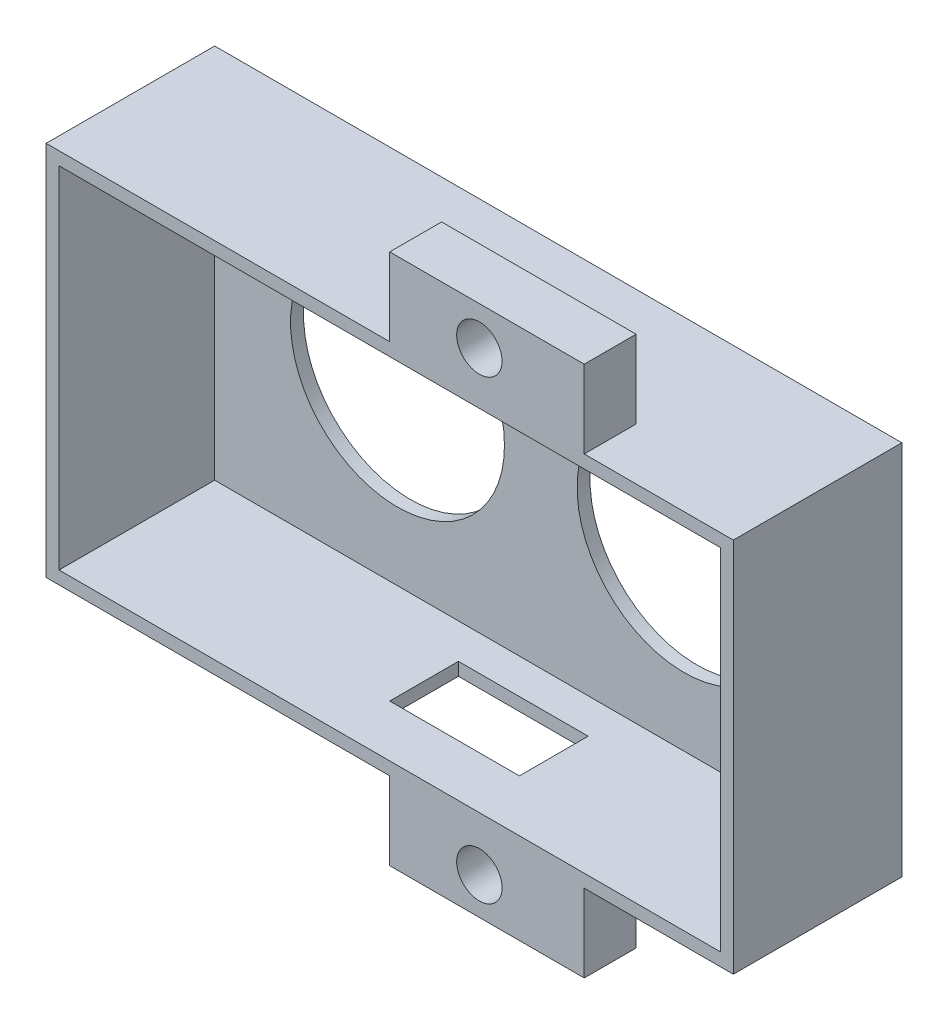
ISO-10303-21;
HEADER;
FILE_DESCRIPTION(('STEP AP214'),'2;1');
FILE_NAME('part.step','',(''),(''),'','','');
FILE_SCHEMA(('AUTOMOTIVE_DESIGN { 1 0 10303 214 1 1 1 1 }'));
ENDSEC;
DATA;
#1=APPLICATION_CONTEXT('core data for automotive mechanical design processes');
#2=APPLICATION_PROTOCOL_DEFINITION('international standard','automotive_design',2000,#1);
#3=PRODUCT_CONTEXT('',#1,'mechanical');
#4=PRODUCT('Part','Part','',(#3));
#5=PRODUCT_RELATED_PRODUCT_CATEGORY('part','',(#4));
#6=PRODUCT_DEFINITION_FORMATION('','',#4);
#7=PRODUCT_DEFINITION_CONTEXT('part definition',#1,'design');
#8=PRODUCT_DEFINITION('design','',#6,#7);
#9=PRODUCT_DEFINITION_SHAPE('','',#8);
#10=(LENGTH_UNIT() NAMED_UNIT(*) SI_UNIT(.MILLI.,.METRE.));
#11=(NAMED_UNIT(*) PLANE_ANGLE_UNIT() SI_UNIT($,.RADIAN.));
#12=(NAMED_UNIT(*) SI_UNIT($,.STERADIAN.) SOLID_ANGLE_UNIT());
#13=UNCERTAINTY_MEASURE_WITH_UNIT(LENGTH_MEASURE(1.E-05),#10,'distance_accuracy_value','');
#14=(GEOMETRIC_REPRESENTATION_CONTEXT(3) GLOBAL_UNCERTAINTY_ASSIGNED_CONTEXT((#13)) GLOBAL_UNIT_ASSIGNED_CONTEXT((#10,
#11,#12)) REPRESENTATION_CONTEXT('',''));
#15=CARTESIAN_POINT('',(0.,0.,0.));
#16=DIRECTION('',(0.,0.,1.));
#17=DIRECTION('',(1.,0.,0.));
#18=AXIS2_PLACEMENT_3D('',#15,#16,#17);
#19=CARTESIAN_POINT('',(-26.5,-14.5,13.));
#20=DIRECTION('',(0.,1.,0.));
#21=DIRECTION('',(0.,0.,1.));
#22=AXIS2_PLACEMENT_3D('',#19,#20,#21);
#23=PLANE('',#22);
#24=DIRECTION('',(0.,0.,1.));
#25=VECTOR('',#24,1.);
#26=CARTESIAN_POINT('',(15.,-14.5,9.));
#27=LINE('',#26,#25);
#28=CARTESIAN_POINT('',(15.,-14.5,9.));
#29=VERTEX_POINT('',#28);
#30=CARTESIAN_POINT('',(15.,-14.5,13.));
#31=VERTEX_POINT('',#30);
#32=EDGE_CURVE('E224',#29,#31,#27,.T.);
#33=ORIENTED_EDGE('',*,*,#32,.F.);
#34=DIRECTION('',(-1.,0.,0.));
#35=VECTOR('',#34,1.);
#36=CARTESIAN_POINT('',(0.,-14.5,9.));
#37=LINE('',#36,#35);
#38=CARTESIAN_POINT('',(6.,-14.5,9.));
#39=VERTEX_POINT('',#38);
#40=EDGE_CURVE('E189',#29,#39,#37,.T.);
#41=ORIENTED_EDGE('',*,*,#40,.T.);
#42=DIRECTION('',(0.,0.,1.));
#43=VECTOR('',#42,1.);
#44=CARTESIAN_POINT('',(6.,-14.5,9.));
#45=LINE('',#44,#43);
#46=CARTESIAN_POINT('',(6.,-14.5,3.7));
#47=VERTEX_POINT('',#46);
#48=EDGE_CURVE('E258',#47,#39,#45,.T.);
#49=ORIENTED_EDGE('',*,*,#48,.F.);
#50=DIRECTION('',(1.,0.,0.));
#51=VECTOR('',#50,1.);
#52=CARTESIAN_POINT('',(-4.,-14.5,3.7));
#53=LINE('',#52,#51);
#54=CARTESIAN_POINT('',(-4.,-14.5,3.7));
#55=VERTEX_POINT('',#54);
#56=EDGE_CURVE('E277',#55,#47,#53,.T.);
#57=ORIENTED_EDGE('',*,*,#56,.F.);
#58=DIRECTION('',(0.,0.,-1.));
#59=VECTOR('',#58,1.);
#60=CARTESIAN_POINT('',(-4.,-14.5,9.));
#61=LINE('',#60,#59);
#62=CARTESIAN_POINT('',(-4.,-14.5,9.));
#63=VERTEX_POINT('',#62);
#64=EDGE_CURVE('E273',#63,#55,#61,.T.);
#65=ORIENTED_EDGE('',*,*,#64,.F.);
#66=DIRECTION('',(-1.,0.,0.));
#67=VECTOR('',#66,1.);
#68=CARTESIAN_POINT('',(-4.,-14.5,9.));
#69=LINE('',#68,#67);
#70=CARTESIAN_POINT('',(0.,-14.5,9.));
#71=VERTEX_POINT('',#70);
#72=EDGE_CURVE('E270',#71,#63,#69,.T.);
#73=ORIENTED_EDGE('',*,*,#72,.F.);
#74=DIRECTION('',(0.,0.,1.));
#75=VECTOR('',#74,1.);
#76=CARTESIAN_POINT('',(0.,-14.5,9.));
#77=LINE('',#76,#75);
#78=CARTESIAN_POINT('',(0.,-14.5,13.));
#79=VERTEX_POINT('',#78);
#80=EDGE_CURVE('E202',#71,#79,#77,.T.);
#81=ORIENTED_EDGE('',*,*,#80,.T.);
#82=DIRECTION('',(1.,0.,0.));
#83=VECTOR('',#82,1.);
#84=CARTESIAN_POINT('',(-26.5,-14.5,13.));
#85=LINE('',#84,#83);
#86=CARTESIAN_POINT('',(-26.5,-14.5,13.));
#87=VERTEX_POINT('',#86);
#88=EDGE_CURVE('E365',#87,#79,#85,.T.);
#89=ORIENTED_EDGE('',*,*,#88,.F.);
#90=DIRECTION('',(0.,0.,-1.));
#91=VECTOR('',#90,1.);
#92=CARTESIAN_POINT('',(-26.5,-14.5,13.));
#93=LINE('',#92,#91);
#94=CARTESIAN_POINT('',(-26.5,-14.5,0.));
#95=VERTEX_POINT('',#94);
#96=EDGE_CURVE('E384',#87,#95,#93,.T.);
#97=ORIENTED_EDGE('',*,*,#96,.T.);
#98=DIRECTION('',(1.,0.,0.));
#99=VECTOR('',#98,1.);
#100=CARTESIAN_POINT('',(-26.5,-14.5,0.));
#101=LINE('',#100,#99);
#102=CARTESIAN_POINT('',(26.5,-14.5,0.));
#103=VERTEX_POINT('',#102);
#104=EDGE_CURVE('E356',#95,#103,#101,.T.);
#105=ORIENTED_EDGE('',*,*,#104,.T.);
#106=DIRECTION('',(0.,0.,-1.));
#107=VECTOR('',#106,1.);
#108=CARTESIAN_POINT('',(26.5,-14.5,13.));
#109=LINE('',#108,#107);
#110=CARTESIAN_POINT('',(26.5,-14.5,13.));
#111=VERTEX_POINT('',#110);
#112=EDGE_CURVE('E369',#111,#103,#109,.T.);
#113=ORIENTED_EDGE('',*,*,#112,.F.);
#114=EDGE_CURVE('E364',#31,#111,#85,.T.);
#115=ORIENTED_EDGE('',*,*,#114,.F.);
#116=EDGE_LOOP('',(#33,#41,#49,#57,#65,#73,#81,#89,#97,#105,#113,#115));
#117=FACE_BOUND('',#116,.T.);
#118=ADVANCED_FACE('F41',(#117),#23,.F.);
#119=CARTESIAN_POINT('',(-26.5,14.5,13.));
#120=DIRECTION('',(0.,-1.,0.));
#121=DIRECTION('',(0.,0.,-1.));
#122=AXIS2_PLACEMENT_3D('',#119,#120,#121);
#123=PLANE('',#122);
#124=DIRECTION('',(0.,0.,1.));
#125=VECTOR('',#124,1.);
#126=CARTESIAN_POINT('',(0.,14.5,9.));
#127=LINE('',#126,#125);
#128=CARTESIAN_POINT('',(0.,14.5,9.));
#129=VERTEX_POINT('',#128);
#130=CARTESIAN_POINT('',(0.,14.5,13.));
#131=VERTEX_POINT('',#130);
#132=EDGE_CURVE('E246',#129,#131,#127,.T.);
#133=ORIENTED_EDGE('',*,*,#132,.F.);
#134=DIRECTION('',(1.,0.,0.));
#135=VECTOR('',#134,1.);
#136=CARTESIAN_POINT('',(0.,14.5,9.));
#137=LINE('',#136,#135);
#138=CARTESIAN_POINT('',(15.,14.5,9.));
#139=VERTEX_POINT('',#138);
#140=EDGE_CURVE('E233',#129,#139,#137,.T.);
#141=ORIENTED_EDGE('',*,*,#140,.T.);
#142=DIRECTION('',(0.,0.,1.));
#143=VECTOR('',#142,1.);
#144=CARTESIAN_POINT('',(15.,14.5,9.));
#145=LINE('',#144,#143);
#146=CARTESIAN_POINT('',(15.,14.5,13.));
#147=VERTEX_POINT('',#146);
#148=EDGE_CURVE('E262',#139,#147,#145,.T.);
#149=ORIENTED_EDGE('',*,*,#148,.T.);
#150=DIRECTION('',(-1.,0.,0.));
#151=VECTOR('',#150,1.);
#152=CARTESIAN_POINT('',(-26.5,14.5,13.));
#153=LINE('',#152,#151);
#154=CARTESIAN_POINT('',(26.5,14.5,13.));
#155=VERTEX_POINT('',#154);
#156=EDGE_CURVE('E357',#155,#147,#153,.T.);
#157=ORIENTED_EDGE('',*,*,#156,.F.);
#158=DIRECTION('',(0.,0.,-1.));
#159=VECTOR('',#158,1.);
#160=CARTESIAN_POINT('',(26.5,14.5,13.));
#161=LINE('',#160,#159);
#162=CARTESIAN_POINT('',(26.5,14.5,0.));
#163=VERTEX_POINT('',#162);
#164=EDGE_CURVE('E392',#155,#163,#161,.T.);
#165=ORIENTED_EDGE('',*,*,#164,.T.);
#166=DIRECTION('',(-1.,0.,0.));
#167=VECTOR('',#166,1.);
#168=CARTESIAN_POINT('',(-26.5,14.5,0.));
#169=LINE('',#168,#167);
#170=CARTESIAN_POINT('',(-26.5,14.5,0.));
#171=VERTEX_POINT('',#170);
#172=EDGE_CURVE('E373',#163,#171,#169,.T.);
#173=ORIENTED_EDGE('',*,*,#172,.T.);
#174=DIRECTION('',(0.,0.,-1.));
#175=VECTOR('',#174,1.);
#176=CARTESIAN_POINT('',(-26.5,14.5,13.));
#177=LINE('',#176,#175);
#178=CARTESIAN_POINT('',(-26.5,14.5,13.));
#179=VERTEX_POINT('',#178);
#180=EDGE_CURVE('E388',#179,#171,#177,.T.);
#181=ORIENTED_EDGE('',*,*,#180,.F.);
#182=EDGE_CURVE('E355',#131,#179,#153,.T.);
#183=ORIENTED_EDGE('',*,*,#182,.F.);
#184=EDGE_LOOP('',(#133,#141,#149,#157,#165,#173,#181,#183));
#185=FACE_BOUND('',#184,.T.);
#186=ADVANCED_FACE('F466',(#185),#123,.F.);
#187=CARTESIAN_POINT('',(0.,0.,1.));
#188=DIRECTION('',(0.,0.,-1.));
#189=DIRECTION('',(-1.,0.,0.));
#190=AXIS2_PLACEMENT_3D('',#187,#188,#189);
#191=PLANE('',#190);
#192=CARTESIAN_POINT('',(10.7,0.,1.));
#193=DIRECTION('',(0.,0.,1.));
#194=DIRECTION('',(1.,0.,0.));
#195=AXIS2_PLACEMENT_3D('',#192,#193,#194);
#196=CIRCLE('',#195,8.25);
#197=CARTESIAN_POINT('',(18.95,0.,0.999999999999999));
#198=VERTEX_POINT('',#197);
#199=EDGE_CURVE('E285',#198,#198,#196,.T.);
#200=ORIENTED_EDGE('',*,*,#199,.F.);
#201=EDGE_LOOP('',(#200));
#202=FACE_BOUND('',#201,.T.);
#203=DIRECTION('',(0.,1.,0.));
#204=VECTOR('',#203,1.);
#205=CARTESIAN_POINT('',(25.5,0.,1.));
#206=LINE('',#205,#204);
#207=CARTESIAN_POINT('',(25.5,-13.5,1.));
#208=VERTEX_POINT('',#207);
#209=CARTESIAN_POINT('',(25.5,13.5,1.));
#210=VERTEX_POINT('',#209);
#211=EDGE_CURVE('E308',#208,#210,#206,.T.);
#212=ORIENTED_EDGE('',*,*,#211,.T.);
#213=DIRECTION('',(-1.,0.,0.));
#214=VECTOR('',#213,1.);
#215=CARTESIAN_POINT('',(0.,13.5,1.));
#216=LINE('',#215,#214);
#217=CARTESIAN_POINT('',(-25.5,13.5,1.));
#218=VERTEX_POINT('',#217);
#219=EDGE_CURVE('E312',#210,#218,#216,.T.);
#220=ORIENTED_EDGE('',*,*,#219,.T.);
#221=DIRECTION('',(0.,-1.,0.));
#222=VECTOR('',#221,1.);
#223=CARTESIAN_POINT('',(-25.5,0.,1.));
#224=LINE('',#223,#222);
#225=CARTESIAN_POINT('',(-25.5,-13.5,1.));
#226=VERTEX_POINT('',#225);
#227=EDGE_CURVE('E327',#218,#226,#224,.T.);
#228=ORIENTED_EDGE('',*,*,#227,.T.);
#229=DIRECTION('',(1.,0.,0.));
#230=VECTOR('',#229,1.);
#231=CARTESIAN_POINT('',(0.,-13.5,1.));
#232=LINE('',#231,#230);
#233=EDGE_CURVE('E333',#226,#208,#232,.T.);
#234=ORIENTED_EDGE('',*,*,#233,.T.);
#235=EDGE_LOOP('',(#212,#220,#228,#234));
#236=FACE_BOUND('',#235,.T.);
#237=CARTESIAN_POINT('',(-11.4,0.,1.));
#238=DIRECTION('',(0.,0.,1.));
#239=DIRECTION('',(1.,0.,0.));
#240=AXIS2_PLACEMENT_3D('',#237,#238,#239);
#241=CIRCLE('',#240,8.25);
#242=CARTESIAN_POINT('',(-3.15,0.,0.999999999999999));
#243=VERTEX_POINT('',#242);
#244=EDGE_CURVE('E296',#243,#243,#241,.T.);
#245=ORIENTED_EDGE('',*,*,#244,.F.);
#246=EDGE_LOOP('',(#245));
#247=FACE_BOUND('',#246,.T.);
#248=ADVANCED_FACE('F429',(#202,#236,#247),#191,.F.);
#249=CARTESIAN_POINT('',(0.,0.,13.));
#250=DIRECTION('',(0.,0.,-1.));
#251=DIRECTION('',(-1.,0.,0.));
#252=AXIS2_PLACEMENT_3D('',#249,#250,#251);
#253=PLANE('',#252);
#254=CARTESIAN_POINT('',(6.91484098680728,17.5336868006783,13.));
#255=DIRECTION('',(0.,0.,1.));
#256=DIRECTION('',(1.,0.,0.));
#257=AXIS2_PLACEMENT_3D('',#254,#255,#256);
#258=CIRCLE('',#257,1.75);
#259=CARTESIAN_POINT('',(8.66484098680728,17.5336868006783,13.));
#260=VERTEX_POINT('',#259);
#261=EDGE_CURVE('E410',#260,#260,#258,.T.);
#262=ORIENTED_EDGE('',*,*,#261,.F.);
#263=EDGE_LOOP('',(#262));
#264=FACE_BOUND('',#263,.T.);
#265=CARTESIAN_POINT('',(6.91484098680728,-17.6470831322008,13.));
#266=DIRECTION('',(0.,0.,1.));
#267=DIRECTION('',(1.,0.,0.));
#268=AXIS2_PLACEMENT_3D('',#265,#266,#267);
#269=CIRCLE('',#268,1.75);
#270=CARTESIAN_POINT('',(8.66484098680728,-17.6470831322008,13.));
#271=VERTEX_POINT('',#270);
#272=EDGE_CURVE('E210',#271,#271,#269,.T.);
#273=ORIENTED_EDGE('',*,*,#272,.F.);
#274=EDGE_LOOP('',(#273));
#275=FACE_BOUND('',#274,.T.);
#276=DIRECTION('',(0.,1.,0.));
#277=VECTOR('',#276,1.);
#278=CARTESIAN_POINT('',(26.5,-14.5,13.));
#279=LINE('',#278,#277);
#280=EDGE_CURVE('E351',#111,#155,#279,.T.);
#281=ORIENTED_EDGE('',*,*,#280,.T.);
#282=ORIENTED_EDGE('',*,*,#156,.T.);
#283=DIRECTION('',(0.,1.,0.));
#284=VECTOR('',#283,1.);
#285=CARTESIAN_POINT('',(15.,14.5,13.));
#286=LINE('',#285,#284);
#287=CARTESIAN_POINT('',(15.,20.5,13.));
#288=VERTEX_POINT('',#287);
#289=EDGE_CURVE('E67',#147,#288,#286,.T.);
#290=ORIENTED_EDGE('',*,*,#289,.T.);
#291=DIRECTION('',(-1.,0.,0.));
#292=VECTOR('',#291,1.);
#293=CARTESIAN_POINT('',(0.,20.5,13.));
#294=LINE('',#293,#292);
#295=CARTESIAN_POINT('',(0.,20.5,13.));
#296=VERTEX_POINT('',#295);
#297=EDGE_CURVE('E234',#288,#296,#294,.T.);
#298=ORIENTED_EDGE('',*,*,#297,.T.);
#299=DIRECTION('',(0.,-1.,0.));
#300=VECTOR('',#299,1.);
#301=CARTESIAN_POINT('',(0.,14.5,13.));
#302=LINE('',#301,#300);
#303=EDGE_CURVE('E223',#296,#131,#302,.T.);
#304=ORIENTED_EDGE('',*,*,#303,.T.);
#305=ORIENTED_EDGE('',*,*,#182,.T.);
#306=DIRECTION('',(0.,-1.,0.));
#307=VECTOR('',#306,1.);
#308=CARTESIAN_POINT('',(-26.5,-14.5,13.));
#309=LINE('',#308,#307);
#310=EDGE_CURVE('E361',#179,#87,#309,.T.);
#311=ORIENTED_EDGE('',*,*,#310,.T.);
#312=ORIENTED_EDGE('',*,*,#88,.T.);
#313=DIRECTION('',(0.,-1.,0.));
#314=VECTOR('',#313,1.);
#315=CARTESIAN_POINT('',(0.,-14.5,13.));
#316=LINE('',#315,#314);
#317=CARTESIAN_POINT('',(0.,-20.5,13.));
#318=VERTEX_POINT('',#317);
#319=EDGE_CURVE('E59',#79,#318,#316,.T.);
#320=ORIENTED_EDGE('',*,*,#319,.T.);
#321=DIRECTION('',(1.,0.,0.));
#322=VECTOR('',#321,1.);
#323=CARTESIAN_POINT('',(0.,-20.5,13.));
#324=LINE('',#323,#322);
#325=CARTESIAN_POINT('',(15.,-20.5,13.));
#326=VERTEX_POINT('',#325);
#327=EDGE_CURVE('E185',#318,#326,#324,.T.);
#328=ORIENTED_EDGE('',*,*,#327,.T.);
#329=DIRECTION('',(0.,1.,0.));
#330=VECTOR('',#329,1.);
#331=CARTESIAN_POINT('',(15.,-14.5,13.));
#332=LINE('',#331,#330);
#333=EDGE_CURVE('E204',#326,#31,#332,.T.);
#334=ORIENTED_EDGE('',*,*,#333,.T.);
#335=ORIENTED_EDGE('',*,*,#114,.T.);
#336=EDGE_LOOP('',(#281,#282,#290,#298,#304,#305,#311,#312,#320,#328,#334,#335));
#337=FACE_BOUND('',#336,.T.);
#338=DIRECTION('',(0.,1.,0.));
#339=VECTOR('',#338,1.);
#340=CARTESIAN_POINT('',(25.5,0.,13.));
#341=LINE('',#340,#339);
#342=CARTESIAN_POINT('',(25.5,-13.5,13.));
#343=VERTEX_POINT('',#342);
#344=CARTESIAN_POINT('',(25.5,13.5,13.));
#345=VERTEX_POINT('',#344);
#346=EDGE_CURVE('E339',#343,#345,#341,.T.);
#347=ORIENTED_EDGE('',*,*,#346,.F.);
#348=DIRECTION('',(1.,0.,0.));
#349=VECTOR('',#348,1.);
#350=CARTESIAN_POINT('',(0.,-13.5,13.));
#351=LINE('',#350,#349);
#352=CARTESIAN_POINT('',(-25.5,-13.5,13.));
#353=VERTEX_POINT('',#352);
#354=EDGE_CURVE('E324',#353,#343,#351,.T.);
#355=ORIENTED_EDGE('',*,*,#354,.F.);
#356=DIRECTION('',(0.,-1.,0.));
#357=VECTOR('',#356,1.);
#358=CARTESIAN_POINT('',(-25.5,0.,13.));
#359=LINE('',#358,#357);
#360=CARTESIAN_POINT('',(-25.5,13.5,13.));
#361=VERTEX_POINT('',#360);
#362=EDGE_CURVE('E345',#361,#353,#359,.T.);
#363=ORIENTED_EDGE('',*,*,#362,.F.);
#364=DIRECTION('',(-1.,0.,0.));
#365=VECTOR('',#364,1.);
#366=CARTESIAN_POINT('',(0.,13.5,13.));
#367=LINE('',#366,#365);
#368=EDGE_CURVE('E342',#345,#361,#367,.T.);
#369=ORIENTED_EDGE('',*,*,#368,.F.);
#370=EDGE_LOOP('',(#347,#355,#363,#369));
#371=FACE_BOUND('',#370,.T.);
#372=ADVANCED_FACE('F426',(#264,#275,#337,#371),#253,.F.);
#373=CARTESIAN_POINT('',(26.5,-14.5,13.));
#374=DIRECTION('',(-1.,0.,0.));
#375=DIRECTION('',(0.,0.,1.));
#376=AXIS2_PLACEMENT_3D('',#373,#374,#375);
#377=PLANE('',#376);
#378=DIRECTION('',(0.,1.,0.));
#379=VECTOR('',#378,1.);
#380=CARTESIAN_POINT('',(26.5,-14.5,0.));
#381=LINE('',#380,#379);
#382=EDGE_CURVE('E317',#103,#163,#381,.T.);
#383=ORIENTED_EDGE('',*,*,#382,.T.);
#384=ORIENTED_EDGE('',*,*,#164,.F.);
#385=ORIENTED_EDGE('',*,*,#280,.F.);
#386=ORIENTED_EDGE('',*,*,#112,.T.);
#387=EDGE_LOOP('',(#383,#384,#385,#386));
#388=FACE_BOUND('',#387,.T.);
#389=ADVANCED_FACE('F43',(#388),#377,.F.);
#390=CARTESIAN_POINT('',(-26.5,-14.5,13.));
#391=DIRECTION('',(1.,0.,0.));
#392=DIRECTION('',(0.,0.,-1.));
#393=AXIS2_PLACEMENT_3D('',#390,#391,#392);
#394=PLANE('',#393);
#395=DIRECTION('',(0.,-1.,0.));
#396=VECTOR('',#395,1.);
#397=CARTESIAN_POINT('',(-26.5,-14.5,0.));
#398=LINE('',#397,#396);
#399=EDGE_CURVE('E376',#171,#95,#398,.T.);
#400=ORIENTED_EDGE('',*,*,#399,.T.);
#401=ORIENTED_EDGE('',*,*,#96,.F.);
#402=ORIENTED_EDGE('',*,*,#310,.F.);
#403=ORIENTED_EDGE('',*,*,#180,.T.);
#404=EDGE_LOOP('',(#400,#401,#402,#403));
#405=FACE_BOUND('',#404,.T.);
#406=ADVANCED_FACE('F477',(#405),#394,.F.);
#407=CARTESIAN_POINT('',(0.,0.,0.));
#408=DIRECTION('',(0.,0.,-1.));
#409=DIRECTION('',(-1.,0.,0.));
#410=AXIS2_PLACEMENT_3D('',#407,#408,#409);
#411=PLANE('',#410);
#412=CARTESIAN_POINT('',(-11.4,0.,0.));
#413=DIRECTION('',(0.,0.,-1.));
#414=DIRECTION('',(-1.,0.,0.));
#415=AXIS2_PLACEMENT_3D('',#412,#413,#414);
#416=CIRCLE('',#415,8.25);
#417=CARTESIAN_POINT('',(-3.15,0.,0.));
#418=VERTEX_POINT('',#417);
#419=EDGE_CURVE('E307',#418,#418,#416,.T.);
#420=ORIENTED_EDGE('',*,*,#419,.F.);
#421=EDGE_LOOP('',(#420));
#422=FACE_BOUND('',#421,.T.);
#423=CARTESIAN_POINT('',(10.7,0.,0.));
#424=DIRECTION('',(0.,0.,-1.));
#425=DIRECTION('',(-1.,0.,0.));
#426=AXIS2_PLACEMENT_3D('',#423,#424,#425);
#427=CIRCLE('',#426,8.25);
#428=CARTESIAN_POINT('',(18.95,0.,0.));
#429=VERTEX_POINT('',#428);
#430=EDGE_CURVE('E300',#429,#429,#427,.T.);
#431=ORIENTED_EDGE('',*,*,#430,.F.);
#432=EDGE_LOOP('',(#431));
#433=FACE_BOUND('',#432,.T.);
#434=ORIENTED_EDGE('',*,*,#382,.F.);
#435=ORIENTED_EDGE('',*,*,#104,.F.);
#436=ORIENTED_EDGE('',*,*,#399,.F.);
#437=ORIENTED_EDGE('',*,*,#172,.F.);
#438=EDGE_LOOP('',(#434,#435,#436,#437));
#439=FACE_BOUND('',#438,.T.);
#440=ADVANCED_FACE('F476',(#422,#433,#439),#411,.T.);
#441=CARTESIAN_POINT('',(25.5,-14.5,13.));
#442=DIRECTION('',(-1.,0.,0.));
#443=DIRECTION('',(0.,0.,1.));
#444=AXIS2_PLACEMENT_3D('',#441,#442,#443);
#445=PLANE('',#444);
#446=ORIENTED_EDGE('',*,*,#211,.F.);
#447=DIRECTION('',(0.,0.,-1.));
#448=VECTOR('',#447,1.);
#449=CARTESIAN_POINT('',(25.5,-13.5,13.));
#450=LINE('',#449,#448);
#451=EDGE_CURVE('E319',#343,#208,#450,.T.);
#452=ORIENTED_EDGE('',*,*,#451,.F.);
#453=ORIENTED_EDGE('',*,*,#346,.T.);
#454=DIRECTION('',(0.,0.,-1.));
#455=VECTOR('',#454,1.);
#456=CARTESIAN_POINT('',(25.5,13.5,13.));
#457=LINE('',#456,#455);
#458=EDGE_CURVE('E313',#345,#210,#457,.T.);
#459=ORIENTED_EDGE('',*,*,#458,.T.);
#460=EDGE_LOOP('',(#446,#452,#453,#459));
#461=FACE_BOUND('',#460,.T.);
#462=ADVANCED_FACE('F443',(#461),#445,.T.);
#463=CARTESIAN_POINT('',(-26.5,13.5,13.));
#464=DIRECTION('',(0.,-1.,0.));
#465=DIRECTION('',(0.,0.,-1.));
#466=AXIS2_PLACEMENT_3D('',#463,#464,#465);
#467=PLANE('',#466);
#468=ORIENTED_EDGE('',*,*,#219,.F.);
#469=ORIENTED_EDGE('',*,*,#458,.F.);
#470=ORIENTED_EDGE('',*,*,#368,.T.);
#471=DIRECTION('',(0.,0.,-1.));
#472=VECTOR('',#471,1.);
#473=CARTESIAN_POINT('',(-25.5,13.5,13.));
#474=LINE('',#473,#472);
#475=EDGE_CURVE('E318',#361,#218,#474,.T.);
#476=ORIENTED_EDGE('',*,*,#475,.T.);
#477=EDGE_LOOP('',(#468,#469,#470,#476));
#478=FACE_BOUND('',#477,.T.);
#479=ADVANCED_FACE('F445',(#478),#467,.T.);
#480=CARTESIAN_POINT('',(-25.5,-14.5,13.));
#481=DIRECTION('',(1.,0.,0.));
#482=DIRECTION('',(0.,0.,-1.));
#483=AXIS2_PLACEMENT_3D('',#480,#481,#482);
#484=PLANE('',#483);
#485=ORIENTED_EDGE('',*,*,#227,.F.);
#486=ORIENTED_EDGE('',*,*,#475,.F.);
#487=ORIENTED_EDGE('',*,*,#362,.T.);
#488=DIRECTION('',(0.,0.,-1.));
#489=VECTOR('',#488,1.);
#490=CARTESIAN_POINT('',(-25.5,-13.5,13.));
#491=LINE('',#490,#489);
#492=EDGE_CURVE('E323',#353,#226,#491,.T.);
#493=ORIENTED_EDGE('',*,*,#492,.T.);
#494=EDGE_LOOP('',(#485,#486,#487,#493));
#495=FACE_BOUND('',#494,.T.);
#496=ADVANCED_FACE('F454',(#495),#484,.T.);
#497=CARTESIAN_POINT('',(-26.5,-13.5,13.));
#498=DIRECTION('',(0.,1.,0.));
#499=DIRECTION('',(0.,0.,1.));
#500=AXIS2_PLACEMENT_3D('',#497,#498,#499);
#501=PLANE('',#500);
#502=DIRECTION('',(0.,0.,-1.));
#503=VECTOR('',#502,1.);
#504=CARTESIAN_POINT('',(5.99999999999999,-13.5,13.));
#505=LINE('',#504,#503);
#506=CARTESIAN_POINT('',(6.,-13.5,9.));
#507=VERTEX_POINT('',#506);
#508=CARTESIAN_POINT('',(6.,-13.5,3.7));
#509=VERTEX_POINT('',#508);
#510=EDGE_CURVE('E11',#507,#509,#505,.T.);
#511=ORIENTED_EDGE('',*,*,#510,.F.);
#512=DIRECTION('',(1.,0.,0.));
#513=VECTOR('',#512,1.);
#514=CARTESIAN_POINT('',(-26.5,-13.5,9.));
#515=LINE('',#514,#513);
#516=CARTESIAN_POINT('',(-4.,-13.5,9.));
#517=VERTEX_POINT('',#516);
#518=EDGE_CURVE('E396',#517,#507,#515,.T.);
#519=ORIENTED_EDGE('',*,*,#518,.F.);
#520=DIRECTION('',(0.,0.,1.));
#521=VECTOR('',#520,1.);
#522=CARTESIAN_POINT('',(-4.,-13.5,13.));
#523=LINE('',#522,#521);
#524=CARTESIAN_POINT('',(-4.,-13.5,3.7));
#525=VERTEX_POINT('',#524);
#526=EDGE_CURVE('E402',#525,#517,#523,.T.);
#527=ORIENTED_EDGE('',*,*,#526,.F.);
#528=DIRECTION('',(-1.,0.,0.));
#529=VECTOR('',#528,1.);
#530=CARTESIAN_POINT('',(-26.5,-13.5,3.7));
#531=LINE('',#530,#529);
#532=EDGE_CURVE('E51',#509,#525,#531,.T.);
#533=ORIENTED_EDGE('',*,*,#532,.F.);
#534=EDGE_LOOP('',(#511,#519,#527,#533));
#535=FACE_BOUND('',#534,.T.);
#536=ORIENTED_EDGE('',*,*,#233,.F.);
#537=ORIENTED_EDGE('',*,*,#492,.F.);
#538=ORIENTED_EDGE('',*,*,#354,.T.);
#539=ORIENTED_EDGE('',*,*,#451,.T.);
#540=EDGE_LOOP('',(#536,#537,#538,#539));
#541=FACE_BOUND('',#540,.T.);
#542=ADVANCED_FACE('F452',(#535,#541),#501,.T.);
#543=CARTESIAN_POINT('',(10.7,0.,-12.));
#544=DIRECTION('',(0.,0.,1.));
#545=DIRECTION('',(1.,0.,0.));
#546=AXIS2_PLACEMENT_3D('',#543,#544,#545);
#547=CYLINDRICAL_SURFACE('',#546,8.25);
#548=CARTESIAN_POINT('',(18.95,0.,0.));
#549=CARTESIAN_POINT('',(18.95,0.,0.0104166666666684));
#550=CARTESIAN_POINT('',(18.95,0.,0.0208333333333351));
#551=CARTESIAN_POINT('',(18.95,0.,0.0416666666666684));
#552=CARTESIAN_POINT('',(18.95,0.,0.0520833333333351));
#553=CARTESIAN_POINT('',(18.95,0.,0.0729166666666685));
#554=CARTESIAN_POINT('',(18.95,0.,0.0833333333333351));
#555=CARTESIAN_POINT('',(18.95,0.,0.104166666666669));
#556=CARTESIAN_POINT('',(18.95,0.,0.114583333333335));
#557=CARTESIAN_POINT('',(18.95,0.,0.135416666666669));
#558=CARTESIAN_POINT('',(18.95,0.,0.145833333333335));
#559=CARTESIAN_POINT('',(18.95,0.,0.166666666666669));
#560=CARTESIAN_POINT('',(18.95,0.,0.177083333333335));
#561=CARTESIAN_POINT('',(18.95,0.,0.197916666666669));
#562=CARTESIAN_POINT('',(18.95,0.,0.208333333333335));
#563=CARTESIAN_POINT('',(18.95,0.,0.229166666666669));
#564=CARTESIAN_POINT('',(18.95,0.,0.239583333333335));
#565=CARTESIAN_POINT('',(18.95,0.,0.260416666666668));
#566=CARTESIAN_POINT('',(18.95,0.,0.270833333333334));
#567=CARTESIAN_POINT('',(18.95,0.,0.291666666666667));
#568=CARTESIAN_POINT('',(18.95,0.,0.302083333333334));
#569=CARTESIAN_POINT('',(18.95,0.,0.322916666666667));
#570=CARTESIAN_POINT('',(18.95,0.,0.333333333333334));
#571=CARTESIAN_POINT('',(18.95,0.,0.354166666666667));
#572=CARTESIAN_POINT('',(18.95,0.,0.364583333333334));
#573=CARTESIAN_POINT('',(18.95,0.,0.385416666666667));
#574=CARTESIAN_POINT('',(18.95,0.,0.395833333333334));
#575=CARTESIAN_POINT('',(18.95,0.,0.416666666666667));
#576=CARTESIAN_POINT('',(18.95,0.,0.427083333333334));
#577=CARTESIAN_POINT('',(18.95,0.,0.447916666666667));
#578=CARTESIAN_POINT('',(18.95,0.,0.458333333333334));
#579=CARTESIAN_POINT('',(18.95,0.,0.479166666666667));
#580=CARTESIAN_POINT('',(18.95,0.,0.489583333333334));
#581=CARTESIAN_POINT('',(18.95,0.,0.510416666666667));
#582=CARTESIAN_POINT('',(18.95,0.,0.520833333333334));
#583=CARTESIAN_POINT('',(18.95,0.,0.541666666666667));
#584=CARTESIAN_POINT('',(18.95,0.,0.552083333333334));
#585=CARTESIAN_POINT('',(18.95,0.,0.572916666666667));
#586=CARTESIAN_POINT('',(18.95,0.,0.583333333333334));
#587=CARTESIAN_POINT('',(18.95,0.,0.604166666666667));
#588=CARTESIAN_POINT('',(18.95,0.,0.614583333333334));
#589=CARTESIAN_POINT('',(18.95,0.,0.635416666666667));
#590=CARTESIAN_POINT('',(18.95,0.,0.645833333333334));
#591=CARTESIAN_POINT('',(18.95,0.,0.666666666666667));
#592=CARTESIAN_POINT('',(18.95,0.,0.677083333333334));
#593=CARTESIAN_POINT('',(18.95,0.,0.697916666666667));
#594=CARTESIAN_POINT('',(18.95,0.,0.708333333333334));
#595=CARTESIAN_POINT('',(18.95,0.,0.729166666666667));
#596=CARTESIAN_POINT('',(18.95,0.,0.739583333333333));
#597=CARTESIAN_POINT('',(18.95,0.,0.760416666666666));
#598=CARTESIAN_POINT('',(18.95,0.,0.770833333333332));
#599=CARTESIAN_POINT('',(18.95,0.,0.791666666666666));
#600=CARTESIAN_POINT('',(18.95,0.,0.802083333333332));
#601=CARTESIAN_POINT('',(18.95,0.,0.822916666666666));
#602=CARTESIAN_POINT('',(18.95,0.,0.833333333333332));
#603=CARTESIAN_POINT('',(18.95,0.,0.854166666666666));
#604=CARTESIAN_POINT('',(18.95,0.,0.864583333333332));
#605=CARTESIAN_POINT('',(18.95,0.,0.885416666666666));
#606=CARTESIAN_POINT('',(18.95,0.,0.895833333333332));
#607=CARTESIAN_POINT('',(18.95,0.,0.916666666666666));
#608=CARTESIAN_POINT('',(18.95,0.,0.927083333333332));
#609=CARTESIAN_POINT('',(18.95,0.,0.947916666666666));
#610=CARTESIAN_POINT('',(18.95,0.,0.958333333333332));
#611=CARTESIAN_POINT('',(18.95,0.,0.979166666666666));
#612=CARTESIAN_POINT('',(18.95,0.,0.989583333333333));
#613=CARTESIAN_POINT('',(18.95,0.,0.999999999999999));
#614=B_SPLINE_CURVE_WITH_KNOTS('',3,(#548,#549,#550,#551,#552,#553,#554,#555,#556,#557,#558,
#559,#560,#561,#562,#563,#564,#565,#566,#567,#568,#569,#570,#571,#572,#573,#574,#575,#576,#577,
#578,#579,#580,#581,#582,#583,#584,#585,#586,#587,#588,#589,#590,#591,#592,#593,#594,#595,#596,
#597,#598,#599,#600,#601,#602,#603,#604,#605,#606,#607,#608,#609,#610,#611,#612,#613),
.UNSPECIFIED.,.F.,.F.,(4,2,2,2,2,2,2,2,2,2,2,2,2,2,2,2,2,2,2,2,2,2,2,2,2,2,2,2,2,2,2,2,4),(0.,
0.03125,0.0625000000000001,0.0937500000000001,0.125,0.15625,0.1875,0.21875,0.25,
0.281249999999999,0.312499999999999,0.343749999999999,0.374999999999999,0.406249999999999,
0.437499999999999,0.468749999999999,0.499999999999999,0.531249999999999,0.562499999999999,
0.593749999999999,0.624999999999999,0.656249999999999,0.687499999999999,0.718749999999999,
0.749999999999997,0.781249999999997,0.812499999999997,0.843749999999997,0.874999999999997,
0.906249999999997,0.937499999999997,0.968749999999997,0.999999999999997),.UNSPECIFIED.);
#615=EDGE_CURVE('BSEAM461',#429,#198,#614,.T.);
#616=ORIENTED_EDGE('',*,*,#430,.T.);
#617=ORIENTED_EDGE('',*,*,#199,.T.);
#618=ORIENTED_EDGE('',*,*,#615,.T.);
#619=ORIENTED_EDGE('',*,*,#615,.F.);
#620=EDGE_LOOP('',(#616,#618,#617,#619));
#621=FACE_BOUND('',#620,.T.);
#622=ADVANCED_FACE('F461',(#621),#547,.F.);
#623=CARTESIAN_POINT('',(-11.4,0.,-12.));
#624=DIRECTION('',(0.,0.,1.));
#625=DIRECTION('',(1.,0.,0.));
#626=AXIS2_PLACEMENT_3D('',#623,#624,#625);
#627=CYLINDRICAL_SURFACE('',#626,8.25);
#628=CARTESIAN_POINT('',(-3.15,0.,0.));
#629=CARTESIAN_POINT('',(-3.15,0.,0.0104166666666684));
#630=CARTESIAN_POINT('',(-3.15,0.,0.0208333333333351));
#631=CARTESIAN_POINT('',(-3.15,0.,0.0416666666666684));
#632=CARTESIAN_POINT('',(-3.15,0.,0.0520833333333351));
#633=CARTESIAN_POINT('',(-3.15,0.,0.0729166666666685));
#634=CARTESIAN_POINT('',(-3.15,0.,0.0833333333333351));
#635=CARTESIAN_POINT('',(-3.15,0.,0.104166666666669));
#636=CARTESIAN_POINT('',(-3.15,0.,0.114583333333335));
#637=CARTESIAN_POINT('',(-3.15,0.,0.135416666666669));
#638=CARTESIAN_POINT('',(-3.15,0.,0.145833333333335));
#639=CARTESIAN_POINT('',(-3.15,0.,0.166666666666669));
#640=CARTESIAN_POINT('',(-3.15,0.,0.177083333333335));
#641=CARTESIAN_POINT('',(-3.15,0.,0.197916666666669));
#642=CARTESIAN_POINT('',(-3.15,0.,0.208333333333335));
#643=CARTESIAN_POINT('',(-3.15,0.,0.229166666666669));
#644=CARTESIAN_POINT('',(-3.15,0.,0.239583333333335));
#645=CARTESIAN_POINT('',(-3.15,0.,0.260416666666668));
#646=CARTESIAN_POINT('',(-3.15,0.,0.270833333333334));
#647=CARTESIAN_POINT('',(-3.15,0.,0.291666666666667));
#648=CARTESIAN_POINT('',(-3.15,0.,0.302083333333334));
#649=CARTESIAN_POINT('',(-3.15,0.,0.322916666666667));
#650=CARTESIAN_POINT('',(-3.15,0.,0.333333333333334));
#651=CARTESIAN_POINT('',(-3.15,0.,0.354166666666667));
#652=CARTESIAN_POINT('',(-3.15,0.,0.364583333333334));
#653=CARTESIAN_POINT('',(-3.15,0.,0.385416666666667));
#654=CARTESIAN_POINT('',(-3.15,0.,0.395833333333334));
#655=CARTESIAN_POINT('',(-3.15,0.,0.416666666666667));
#656=CARTESIAN_POINT('',(-3.15,0.,0.427083333333334));
#657=CARTESIAN_POINT('',(-3.15,0.,0.447916666666667));
#658=CARTESIAN_POINT('',(-3.15,0.,0.458333333333334));
#659=CARTESIAN_POINT('',(-3.15,0.,0.479166666666667));
#660=CARTESIAN_POINT('',(-3.15,0.,0.489583333333334));
#661=CARTESIAN_POINT('',(-3.15,0.,0.510416666666667));
#662=CARTESIAN_POINT('',(-3.15,0.,0.520833333333334));
#663=CARTESIAN_POINT('',(-3.15,0.,0.541666666666667));
#664=CARTESIAN_POINT('',(-3.15,0.,0.552083333333334));
#665=CARTESIAN_POINT('',(-3.15,0.,0.572916666666667));
#666=CARTESIAN_POINT('',(-3.15,0.,0.583333333333334));
#667=CARTESIAN_POINT('',(-3.15,0.,0.604166666666667));
#668=CARTESIAN_POINT('',(-3.15,0.,0.614583333333334));
#669=CARTESIAN_POINT('',(-3.15,0.,0.635416666666667));
#670=CARTESIAN_POINT('',(-3.15,0.,0.645833333333334));
#671=CARTESIAN_POINT('',(-3.15,0.,0.666666666666667));
#672=CARTESIAN_POINT('',(-3.15,0.,0.677083333333334));
#673=CARTESIAN_POINT('',(-3.15,0.,0.697916666666667));
#674=CARTESIAN_POINT('',(-3.15,0.,0.708333333333334));
#675=CARTESIAN_POINT('',(-3.15,0.,0.729166666666667));
#676=CARTESIAN_POINT('',(-3.15,0.,0.739583333333333));
#677=CARTESIAN_POINT('',(-3.15,0.,0.760416666666666));
#678=CARTESIAN_POINT('',(-3.15,0.,0.770833333333332));
#679=CARTESIAN_POINT('',(-3.15,0.,0.791666666666666));
#680=CARTESIAN_POINT('',(-3.15,0.,0.802083333333332));
#681=CARTESIAN_POINT('',(-3.15,0.,0.822916666666666));
#682=CARTESIAN_POINT('',(-3.15,0.,0.833333333333332));
#683=CARTESIAN_POINT('',(-3.15,0.,0.854166666666666));
#684=CARTESIAN_POINT('',(-3.15,0.,0.864583333333332));
#685=CARTESIAN_POINT('',(-3.15,0.,0.885416666666666));
#686=CARTESIAN_POINT('',(-3.15,0.,0.895833333333332));
#687=CARTESIAN_POINT('',(-3.15,0.,0.916666666666666));
#688=CARTESIAN_POINT('',(-3.15,0.,0.927083333333332));
#689=CARTESIAN_POINT('',(-3.15,0.,0.947916666666666));
#690=CARTESIAN_POINT('',(-3.15,0.,0.958333333333332));
#691=CARTESIAN_POINT('',(-3.15,0.,0.979166666666666));
#692=CARTESIAN_POINT('',(-3.15,0.,0.989583333333333));
#693=CARTESIAN_POINT('',(-3.15,0.,0.999999999999999));
#694=B_SPLINE_CURVE_WITH_KNOTS('',3,(#628,#629,#630,#631,#632,#633,#634,#635,#636,#637,#638,
#639,#640,#641,#642,#643,#644,#645,#646,#647,#648,#649,#650,#651,#652,#653,#654,#655,#656,#657,
#658,#659,#660,#661,#662,#663,#664,#665,#666,#667,#668,#669,#670,#671,#672,#673,#674,#675,#676,
#677,#678,#679,#680,#681,#682,#683,#684,#685,#686,#687,#688,#689,#690,#691,#692,#693),
.UNSPECIFIED.,.F.,.F.,(4,2,2,2,2,2,2,2,2,2,2,2,2,2,2,2,2,2,2,2,2,2,2,2,2,2,2,2,2,2,2,2,4),(0.,
0.03125,0.0625000000000001,0.0937500000000001,0.125,0.15625,0.1875,0.21875,0.25,
0.281249999999999,0.312499999999999,0.343749999999999,0.374999999999999,0.406249999999999,
0.437499999999999,0.468749999999999,0.499999999999999,0.531249999999999,0.562499999999999,
0.593749999999999,0.624999999999999,0.656249999999999,0.687499999999999,0.718749999999999,
0.749999999999997,0.781249999999997,0.812499999999997,0.843749999999997,0.874999999999997,
0.906249999999997,0.937499999999997,0.968749999999997,0.999999999999997),.UNSPECIFIED.);
#695=EDGE_CURVE('BSEAM538',#418,#243,#694,.T.);
#696=ORIENTED_EDGE('',*,*,#419,.T.);
#697=ORIENTED_EDGE('',*,*,#244,.T.);
#698=ORIENTED_EDGE('',*,*,#695,.T.);
#699=ORIENTED_EDGE('',*,*,#695,.F.);
#700=EDGE_LOOP('',(#696,#698,#697,#699));
#701=FACE_BOUND('',#700,.T.);
#702=ADVANCED_FACE('F538',(#701),#627,.F.);
#703=CARTESIAN_POINT('',(6.,-1.5,9.));
#704=DIRECTION('',(1.,0.,0.));
#705=DIRECTION('',(0.,0.,-1.));
#706=AXIS2_PLACEMENT_3D('',#703,#704,#705);
#707=PLANE('',#706);
#708=ORIENTED_EDGE('',*,*,#510,.T.);
#709=DIRECTION('',(0.,-1.,0.));
#710=VECTOR('',#709,1.);
#711=CARTESIAN_POINT('',(6.,-1.5,3.7));
#712=LINE('',#711,#710);
#713=EDGE_CURVE('E282',#509,#47,#712,.T.);
#714=ORIENTED_EDGE('',*,*,#713,.T.);
#715=ORIENTED_EDGE('',*,*,#48,.T.);
#716=DIRECTION('',(0.,-1.,0.));
#717=VECTOR('',#716,1.);
#718=CARTESIAN_POINT('',(6.,-1.5,9.));
#719=LINE('',#718,#717);
#720=EDGE_CURVE('E281',#507,#39,#719,.T.);
#721=ORIENTED_EDGE('',*,*,#720,.F.);
#722=EDGE_LOOP('',(#708,#714,#715,#721));
#723=FACE_BOUND('',#722,.T.);
#724=ADVANCED_FACE('F528',(#723),#707,.F.);
#725=CARTESIAN_POINT('',(-4.,-1.5,3.7));
#726=DIRECTION('',(0.,0.,-1.));
#727=DIRECTION('',(-1.,0.,0.));
#728=AXIS2_PLACEMENT_3D('',#725,#726,#727);
#729=PLANE('',#728);
#730=ORIENTED_EDGE('',*,*,#532,.T.);
#731=DIRECTION('',(0.,-1.,0.));
#732=VECTOR('',#731,1.);
#733=CARTESIAN_POINT('',(-4.,-1.5,3.7));
#734=LINE('',#733,#732);
#735=EDGE_CURVE('E286',#525,#55,#734,.T.);
#736=ORIENTED_EDGE('',*,*,#735,.T.);
#737=ORIENTED_EDGE('',*,*,#56,.T.);
#738=ORIENTED_EDGE('',*,*,#713,.F.);
#739=EDGE_LOOP('',(#730,#736,#737,#738));
#740=FACE_BOUND('',#739,.T.);
#741=ADVANCED_FACE('F524',(#740),#729,.F.);
#742=CARTESIAN_POINT('',(-4.,-1.5,9.));
#743=DIRECTION('',(-1.,0.,0.));
#744=DIRECTION('',(0.,0.,1.));
#745=AXIS2_PLACEMENT_3D('',#742,#743,#744);
#746=PLANE('',#745);
#747=ORIENTED_EDGE('',*,*,#526,.T.);
#748=DIRECTION('',(0.,-1.,0.));
#749=VECTOR('',#748,1.);
#750=CARTESIAN_POINT('',(-4.,-1.5,9.));
#751=LINE('',#750,#749);
#752=EDGE_CURVE('E289',#517,#63,#751,.T.);
#753=ORIENTED_EDGE('',*,*,#752,.T.);
#754=ORIENTED_EDGE('',*,*,#64,.T.);
#755=ORIENTED_EDGE('',*,*,#735,.F.);
#756=EDGE_LOOP('',(#747,#753,#754,#755));
#757=FACE_BOUND('',#756,.T.);
#758=ADVANCED_FACE('F527',(#757),#746,.F.);
#759=CARTESIAN_POINT('',(-4.,-1.5,9.));
#760=DIRECTION('',(0.,0.,1.));
#761=DIRECTION('',(1.,0.,0.));
#762=AXIS2_PLACEMENT_3D('',#759,#760,#761);
#763=PLANE('',#762);
#764=CARTESIAN_POINT('',(6.91484098680728,-17.6470831322008,9.));
#765=DIRECTION('',(0.,0.,1.));
#766=DIRECTION('',(1.,0.,0.));
#767=AXIS2_PLACEMENT_3D('',#764,#765,#766);
#768=CIRCLE('',#767,1.75);
#769=CARTESIAN_POINT('',(8.66484098680728,-17.6470831322008,9.));
#770=VERTEX_POINT('',#769);
#771=EDGE_CURVE('E45',#770,#770,#768,.T.);
#772=ORIENTED_EDGE('',*,*,#771,.T.);
#773=EDGE_LOOP('',(#772));
#774=FACE_BOUND('',#773,.T.);
#775=ORIENTED_EDGE('',*,*,#518,.T.);
#776=ORIENTED_EDGE('',*,*,#720,.T.);
#777=ORIENTED_EDGE('',*,*,#40,.F.);
#778=DIRECTION('',(0.,1.,0.));
#779=VECTOR('',#778,1.);
#780=CARTESIAN_POINT('',(15.,-14.5,9.));
#781=LINE('',#780,#779);
#782=CARTESIAN_POINT('',(15.,-20.5,9.));
#783=VERTEX_POINT('',#782);
#784=EDGE_CURVE('E198',#783,#29,#781,.T.);
#785=ORIENTED_EDGE('',*,*,#784,.F.);
#786=DIRECTION('',(1.,0.,0.));
#787=VECTOR('',#786,1.);
#788=CARTESIAN_POINT('',(0.,-20.5,9.));
#789=LINE('',#788,#787);
#790=CARTESIAN_POINT('',(0.,-20.5,9.));
#791=VERTEX_POINT('',#790);
#792=EDGE_CURVE('E183',#791,#783,#789,.T.);
#793=ORIENTED_EDGE('',*,*,#792,.F.);
#794=DIRECTION('',(0.,-1.,0.));
#795=VECTOR('',#794,1.);
#796=CARTESIAN_POINT('',(0.,-14.5,9.));
#797=LINE('',#796,#795);
#798=EDGE_CURVE('E195',#71,#791,#797,.T.);
#799=ORIENTED_EDGE('',*,*,#798,.F.);
#800=ORIENTED_EDGE('',*,*,#72,.T.);
#801=ORIENTED_EDGE('',*,*,#752,.F.);
#802=EDGE_LOOP('',(#775,#776,#777,#785,#793,#799,#800,#801));
#803=FACE_BOUND('',#802,.T.);
#804=ADVANCED_FACE('F194',(#774,#803),#763,.F.);
#805=CARTESIAN_POINT('',(0.,14.5,9.));
#806=DIRECTION('',(-1.,0.,0.));
#807=DIRECTION('',(0.,0.,1.));
#808=AXIS2_PLACEMENT_3D('',#805,#806,#807);
#809=PLANE('',#808);
#810=ORIENTED_EDGE('',*,*,#303,.F.);
#811=DIRECTION('',(0.,0.,1.));
#812=VECTOR('',#811,1.);
#813=CARTESIAN_POINT('',(0.,20.5,9.));
#814=LINE('',#813,#812);
#815=CARTESIAN_POINT('',(0.,20.5,9.));
#816=VERTEX_POINT('',#815);
#817=EDGE_CURVE('E255',#816,#296,#814,.T.);
#818=ORIENTED_EDGE('',*,*,#817,.F.);
#819=DIRECTION('',(0.,-1.,0.));
#820=VECTOR('',#819,1.);
#821=CARTESIAN_POINT('',(0.,14.5,9.));
#822=LINE('',#821,#820);
#823=EDGE_CURVE('E229',#816,#129,#822,.T.);
#824=ORIENTED_EDGE('',*,*,#823,.T.);
#825=ORIENTED_EDGE('',*,*,#132,.T.);
#826=EDGE_LOOP('',(#810,#818,#824,#825));
#827=FACE_BOUND('',#826,.T.);
#828=ADVANCED_FACE('F507',(#827),#809,.T.);
#829=CARTESIAN_POINT('',(0.,20.5,9.));
#830=DIRECTION('',(0.,1.,0.));
#831=DIRECTION('',(0.,0.,1.));
#832=AXIS2_PLACEMENT_3D('',#829,#830,#831);
#833=PLANE('',#832);
#834=ORIENTED_EDGE('',*,*,#297,.F.);
#835=DIRECTION('',(0.,0.,1.));
#836=VECTOR('',#835,1.);
#837=CARTESIAN_POINT('',(15.,20.5,9.));
#838=LINE('',#837,#836);
#839=CARTESIAN_POINT('',(15.,20.5,9.));
#840=VERTEX_POINT('',#839);
#841=EDGE_CURVE('E259',#840,#288,#838,.T.);
#842=ORIENTED_EDGE('',*,*,#841,.F.);
#843=DIRECTION('',(-1.,0.,0.));
#844=VECTOR('',#843,1.);
#845=CARTESIAN_POINT('',(0.,20.5,9.));
#846=LINE('',#845,#844);
#847=EDGE_CURVE('E242',#840,#816,#846,.T.);
#848=ORIENTED_EDGE('',*,*,#847,.T.);
#849=ORIENTED_EDGE('',*,*,#817,.T.);
#850=EDGE_LOOP('',(#834,#842,#848,#849));
#851=FACE_BOUND('',#850,.T.);
#852=ADVANCED_FACE('F503',(#851),#833,.T.);
#853=CARTESIAN_POINT('',(15.,14.5,9.));
#854=DIRECTION('',(1.,0.,0.));
#855=DIRECTION('',(0.,0.,-1.));
#856=AXIS2_PLACEMENT_3D('',#853,#854,#855);
#857=PLANE('',#856);
#858=ORIENTED_EDGE('',*,*,#289,.F.);
#859=ORIENTED_EDGE('',*,*,#148,.F.);
#860=DIRECTION('',(0.,1.,0.));
#861=VECTOR('',#860,1.);
#862=CARTESIAN_POINT('',(15.,14.5,9.));
#863=LINE('',#862,#861);
#864=EDGE_CURVE('E238',#139,#840,#863,.T.);
#865=ORIENTED_EDGE('',*,*,#864,.T.);
#866=ORIENTED_EDGE('',*,*,#841,.T.);
#867=EDGE_LOOP('',(#858,#859,#865,#866));
#868=FACE_BOUND('',#867,.T.);
#869=ADVANCED_FACE('F511',(#868),#857,.T.);
#870=CARTESIAN_POINT('',(0.,0.,9.));
#871=DIRECTION('',(0.,0.,-1.));
#872=DIRECTION('',(-1.,0.,0.));
#873=AXIS2_PLACEMENT_3D('',#870,#871,#872);
#874=PLANE('',#873);
#875=CARTESIAN_POINT('',(6.91484098680728,17.5336868006783,9.));
#876=DIRECTION('',(0.,0.,-1.));
#877=DIRECTION('',(-1.,0.,0.));
#878=AXIS2_PLACEMENT_3D('',#875,#876,#877);
#879=CIRCLE('',#878,1.75);
#880=CARTESIAN_POINT('',(5.16484098680728,17.5336868006783,9.));
#881=VERTEX_POINT('',#880);
#882=EDGE_CURVE('E407',#881,#881,#879,.T.);
#883=ORIENTED_EDGE('',*,*,#882,.F.);
#884=EDGE_LOOP('',(#883));
#885=FACE_BOUND('',#884,.T.);
#886=ORIENTED_EDGE('',*,*,#823,.F.);
#887=ORIENTED_EDGE('',*,*,#847,.F.);
#888=ORIENTED_EDGE('',*,*,#864,.F.);
#889=ORIENTED_EDGE('',*,*,#140,.F.);
#890=EDGE_LOOP('',(#886,#887,#888,#889));
#891=FACE_BOUND('',#890,.T.);
#892=ADVANCED_FACE('F510',(#885,#891),#874,.T.);
#893=CARTESIAN_POINT('',(0.,-14.5,9.));
#894=DIRECTION('',(-1.,0.,0.));
#895=DIRECTION('',(0.,-1.,0.));
#896=AXIS2_PLACEMENT_3D('',#893,#894,#895);
#897=PLANE('',#896);
#898=ORIENTED_EDGE('',*,*,#319,.F.);
#899=ORIENTED_EDGE('',*,*,#80,.F.);
#900=ORIENTED_EDGE('',*,*,#798,.T.);
#901=DIRECTION('',(0.,0.,1.));
#902=VECTOR('',#901,1.);
#903=CARTESIAN_POINT('',(0.,-20.5,9.));
#904=LINE('',#903,#902);
#905=EDGE_CURVE('E180',#791,#318,#904,.T.);
#906=ORIENTED_EDGE('',*,*,#905,.T.);
#907=EDGE_LOOP('',(#898,#899,#900,#906));
#908=FACE_BOUND('',#907,.T.);
#909=ADVANCED_FACE('F201',(#908),#897,.T.);
#910=CARTESIAN_POINT('',(15.,-14.5,9.));
#911=DIRECTION('',(1.,0.,0.));
#912=DIRECTION('',(0.,1.,0.));
#913=AXIS2_PLACEMENT_3D('',#910,#911,#912);
#914=PLANE('',#913);
#915=ORIENTED_EDGE('',*,*,#333,.F.);
#916=DIRECTION('',(0.,0.,1.));
#917=VECTOR('',#916,1.);
#918=CARTESIAN_POINT('',(15.,-20.5,9.));
#919=LINE('',#918,#917);
#920=EDGE_CURVE('E188',#783,#326,#919,.T.);
#921=ORIENTED_EDGE('',*,*,#920,.F.);
#922=ORIENTED_EDGE('',*,*,#784,.T.);
#923=ORIENTED_EDGE('',*,*,#32,.T.);
#924=EDGE_LOOP('',(#915,#921,#922,#923));
#925=FACE_BOUND('',#924,.T.);
#926=ADVANCED_FACE('F649',(#925),#914,.T.);
#927=CARTESIAN_POINT('',(0.,-20.5,9.));
#928=DIRECTION('',(0.,-1.,0.));
#929=DIRECTION('',(0.,0.,-1.));
#930=AXIS2_PLACEMENT_3D('',#927,#928,#929);
#931=PLANE('',#930);
#932=ORIENTED_EDGE('',*,*,#327,.F.);
#933=ORIENTED_EDGE('',*,*,#905,.F.);
#934=ORIENTED_EDGE('',*,*,#792,.T.);
#935=ORIENTED_EDGE('',*,*,#920,.T.);
#936=EDGE_LOOP('',(#932,#933,#934,#935));
#937=FACE_BOUND('',#936,.T.);
#938=ADVANCED_FACE('F182',(#937),#931,.T.);
#939=CARTESIAN_POINT('',(6.91484098680728,17.5336868006783,7.));
#940=DIRECTION('',(0.,0.,1.));
#941=DIRECTION('',(1.,0.,0.));
#942=AXIS2_PLACEMENT_3D('',#939,#940,#941);
#943=CYLINDRICAL_SURFACE('',#942,1.75);
#944=ORIENTED_EDGE('',*,*,#882,.T.);
#945=EDGE_LOOP('',(#944));
#946=FACE_BOUND('',#945,.T.);
#947=ORIENTED_EDGE('',*,*,#261,.T.);
#948=EDGE_LOOP('',(#947));
#949=FACE_BOUND('',#948,.T.);
#950=ADVANCED_FACE('F667',(#946,#949),#943,.F.);
#951=CARTESIAN_POINT('',(6.91484098680728,-17.6470831322008,7.));
#952=DIRECTION('',(0.,0.,1.));
#953=DIRECTION('',(1.,0.,0.));
#954=AXIS2_PLACEMENT_3D('',#951,#952,#953);
#955=CYLINDRICAL_SURFACE('',#954,1.75);
#956=ORIENTED_EDGE('',*,*,#272,.T.);
#957=EDGE_LOOP('',(#956));
#958=FACE_BOUND('',#957,.T.);
#959=ORIENTED_EDGE('',*,*,#771,.F.);
#960=EDGE_LOOP('',(#959));
#961=FACE_BOUND('',#960,.T.);
#962=ADVANCED_FACE('F423',(#958,#961),#955,.F.);
#963=CLOSED_SHELL('',(#118,#186,#248,#372,#389,#406,#440,#462,#479,#496,#542,#622,#702,#724,
#741,#758,#804,#828,#852,#869,#892,#909,#926,#938,#950,#962));
#964=MANIFOLD_SOLID_BREP('B2',#963);
#965=ADVANCED_BREP_SHAPE_REPRESENTATION('',(#18,#964),#14);
#966=SHAPE_DEFINITION_REPRESENTATION(#9,#965);
ENDSEC;
END-ISO-10303-21;
